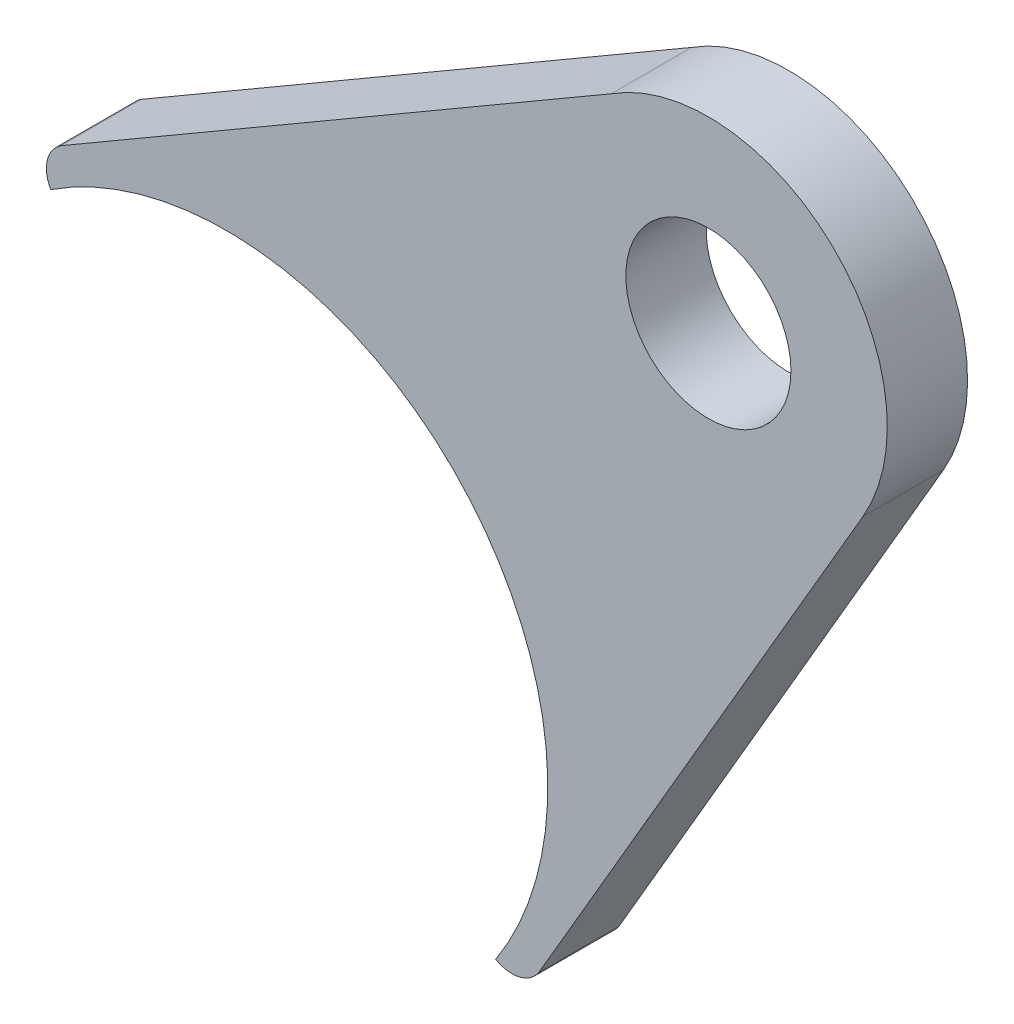
ISO-10303-21;
HEADER;
FILE_DESCRIPTION(('STEP AP214'),'2;1');
FILE_NAME('part.step','',(''),(''),'','','');
FILE_SCHEMA(('AUTOMOTIVE_DESIGN { 1 0 10303 214 1 1 1 1 }'));
ENDSEC;
DATA;
#1=APPLICATION_CONTEXT('core data for automotive mechanical design processes');
#2=APPLICATION_PROTOCOL_DEFINITION('international standard','automotive_design',2000,#1);
#3=PRODUCT_CONTEXT('',#1,'mechanical');
#4=PRODUCT('Part','Part','',(#3));
#5=PRODUCT_RELATED_PRODUCT_CATEGORY('part','',(#4));
#6=PRODUCT_DEFINITION_FORMATION('','',#4);
#7=PRODUCT_DEFINITION_CONTEXT('part definition',#1,'design');
#8=PRODUCT_DEFINITION('design','',#6,#7);
#9=PRODUCT_DEFINITION_SHAPE('','',#8);
#10=(LENGTH_UNIT() NAMED_UNIT(*) SI_UNIT(.MILLI.,.METRE.));
#11=(NAMED_UNIT(*) PLANE_ANGLE_UNIT() SI_UNIT($,.RADIAN.));
#12=(NAMED_UNIT(*) SI_UNIT($,.STERADIAN.) SOLID_ANGLE_UNIT());
#13=UNCERTAINTY_MEASURE_WITH_UNIT(LENGTH_MEASURE(1.E-05),#10,'distance_accuracy_value','');
#14=(GEOMETRIC_REPRESENTATION_CONTEXT(3) GLOBAL_UNCERTAINTY_ASSIGNED_CONTEXT((#13)) GLOBAL_UNIT_ASSIGNED_CONTEXT((#10,
#11,#12)) REPRESENTATION_CONTEXT('',''));
#15=CARTESIAN_POINT('',(0.,0.,0.));
#16=DIRECTION('',(0.,0.,1.));
#17=DIRECTION('',(1.,0.,0.));
#18=AXIS2_PLACEMENT_3D('',#15,#16,#17);
#19=CARTESIAN_POINT('',(-5.85837434433906,11.2675371729913,3.175));
#20=DIRECTION('',(0.,0.,-1.));
#21=DIRECTION('',(-1.,0.,0.));
#22=AXIS2_PLACEMENT_3D('',#19,#20,#21);
#23=PLANE('',#22);
#24=CARTESIAN_POINT('',(-5.85837434433906,11.2675371729913,3.175));
#25=DIRECTION('',(0.,0.,1.));
#26=DIRECTION('',(-1.,0.,0.));
#27=AXIS2_PLACEMENT_3D('',#24,#25,#26);
#28=CIRCLE('',#27,1.26999999999994);
#29=CARTESIAN_POINT('',(-6.54906316048158,12.3332993224671,3.175));
#30=VERTEX_POINT('',#29);
#31=CARTESIAN_POINT('',(-6.9547066047242,10.6264790049294,3.175));
#32=VERTEX_POINT('',#31);
#33=EDGE_CURVE('E159',#30,#32,#28,.T.);
#34=ORIENTED_EDGE('',*,*,#33,.T.);
#35=CARTESIAN_POINT('',(0.,0.,3.175));
#36=DIRECTION('',(0.,0.,-1.));
#37=DIRECTION('',(1.,0.,0.));
#38=AXIS2_PLACEMENT_3D('',#35,#36,#37);
#39=CIRCLE('',#38,12.7);
#40=CARTESIAN_POINT('',(10.6407084109418,-6.93291601804849,3.175));
#41=VERTEX_POINT('',#40);
#42=EDGE_CURVE('E106',#32,#41,#39,.T.);
#43=ORIENTED_EDGE('',*,*,#42,.T.);
#44=CARTESIAN_POINT('',(11.2818459493319,-5.83663017171689,3.175));
#45=DIRECTION('',(0.,0.,1.));
#46=DIRECTION('',(1.,0.,0.));
#47=AXIS2_PLACEMENT_3D('',#44,#45,#46);
#48=CIRCLE('',#47,1.27);
#49=CARTESIAN_POINT('',(12.3488934742751,-6.52533154351209,3.175));
#50=VERTEX_POINT('',#49);
#51=EDGE_CURVE('E119',#41,#50,#48,.T.);
#52=ORIENTED_EDGE('',*,*,#51,.T.);
#53=DIRECTION('',(0.503040153440547,0.864263040993025,0.));
#54=VECTOR('',#53,1.);
#55=CARTESIAN_POINT('',(12.3488934742751,-6.52533154351209,3.175));
#56=LINE('',#55,#54);
#57=CARTESIAN_POINT('',(25.1637103256806,15.4915442585769,3.175));
#58=VERTEX_POINT('',#57);
#59=EDGE_CURVE('E113',#50,#58,#56,.T.);
#60=ORIENTED_EDGE('',*,*,#59,.T.);
#61=CARTESIAN_POINT('',(19.05,19.05,3.175));
#62=DIRECTION('',(0.,0.,1.));
#63=DIRECTION('',(1.,0.,0.));
#64=AXIS2_PLACEMENT_3D('',#61,#62,#63);
#65=CIRCLE('',#64,7.07389999999995);
#66=CARTESIAN_POINT('',(15.2028632940858,24.9862951725809,3.175));
#67=VERTEX_POINT('',#66);
#68=EDGE_CURVE('E117',#58,#67,#65,.T.);
#69=ORIENTED_EDGE('',*,*,#68,.T.);
#70=DIRECTION('',(-0.86439446197605,-0.502814293855232,0.));
#71=VECTOR('',#70,1.);
#72=CARTESIAN_POINT('',(-6.54906316048158,12.3332993224671,3.175));
#73=LINE('',#72,#71);
#74=EDGE_CURVE('E69',#67,#30,#73,.T.);
#75=ORIENTED_EDGE('',*,*,#74,.T.);
#76=EDGE_LOOP('',(#34,#43,#52,#60,#69,#75));
#77=FACE_BOUND('',#76,.T.);
#78=CARTESIAN_POINT('',(19.05,19.05,3.175));
#79=DIRECTION('',(0.,0.,1.));
#80=DIRECTION('',(1.,0.,0.));
#81=AXIS2_PLACEMENT_3D('',#78,#79,#80);
#82=CIRCLE('',#81,3.2639);
#83=CARTESIAN_POINT('',(22.3139,19.05,3.175));
#84=VERTEX_POINT('',#83);
#85=EDGE_CURVE('E147',#84,#84,#82,.T.);
#86=ORIENTED_EDGE('',*,*,#85,.F.);
#87=EDGE_LOOP('',(#86));
#88=FACE_BOUND('',#87,.T.);
#89=ADVANCED_FACE('F51',(#77,#88),#23,.F.);
#90=CARTESIAN_POINT('',(-5.85837434433906,11.2675371729913,0.));
#91=DIRECTION('',(0.,0.,-1.));
#92=DIRECTION('',(-1.,0.,0.));
#93=AXIS2_PLACEMENT_3D('',#90,#91,#92);
#94=PLANE('',#93);
#95=CARTESIAN_POINT('',(-5.85837434433906,11.2675371729913,0.));
#96=DIRECTION('',(0.,0.,1.));
#97=DIRECTION('',(-1.,0.,0.));
#98=AXIS2_PLACEMENT_3D('',#95,#96,#97);
#99=CIRCLE('',#98,1.26999999999994);
#100=CARTESIAN_POINT('',(-6.54906316048158,12.3332993224671,0.));
#101=VERTEX_POINT('',#100);
#102=CARTESIAN_POINT('',(-6.9547066047242,10.6264790049294,0.));
#103=VERTEX_POINT('',#102);
#104=EDGE_CURVE('E142',#101,#103,#99,.T.);
#105=ORIENTED_EDGE('',*,*,#104,.F.);
#106=DIRECTION('',(-0.86439446197605,-0.502814293855232,0.));
#107=VECTOR('',#106,1.);
#108=CARTESIAN_POINT('',(-6.54906316048158,12.3332993224671,0.));
#109=LINE('',#108,#107);
#110=CARTESIAN_POINT('',(15.2028632940858,24.9862951725809,0.));
#111=VERTEX_POINT('',#110);
#112=EDGE_CURVE('E98',#111,#101,#109,.T.);
#113=ORIENTED_EDGE('',*,*,#112,.F.);
#114=CARTESIAN_POINT('',(19.05,19.05,0.));
#115=DIRECTION('',(0.,0.,1.));
#116=DIRECTION('',(1.,0.,0.));
#117=AXIS2_PLACEMENT_3D('',#114,#115,#116);
#118=CIRCLE('',#117,7.07389999999995);
#119=CARTESIAN_POINT('',(25.1637103256806,15.4915442585769,0.));
#120=VERTEX_POINT('',#119);
#121=EDGE_CURVE('E92',#120,#111,#118,.T.);
#122=ORIENTED_EDGE('',*,*,#121,.F.);
#123=DIRECTION('',(0.503040153440547,0.864263040993025,0.));
#124=VECTOR('',#123,1.);
#125=CARTESIAN_POINT('',(12.3488934742751,-6.52533154351209,0.));
#126=LINE('',#125,#124);
#127=CARTESIAN_POINT('',(12.3488934742751,-6.52533154351209,0.));
#128=VERTEX_POINT('',#127);
#129=EDGE_CURVE('E128',#128,#120,#126,.T.);
#130=ORIENTED_EDGE('',*,*,#129,.F.);
#131=CARTESIAN_POINT('',(11.2818459493319,-5.83663017171689,0.));
#132=DIRECTION('',(0.,0.,1.));
#133=DIRECTION('',(1.,0.,0.));
#134=AXIS2_PLACEMENT_3D('',#131,#132,#133);
#135=CIRCLE('',#134,1.27);
#136=CARTESIAN_POINT('',(10.6407084109418,-6.93291601804849,0.));
#137=VERTEX_POINT('',#136);
#138=EDGE_CURVE('E150',#137,#128,#135,.T.);
#139=ORIENTED_EDGE('',*,*,#138,.F.);
#140=CARTESIAN_POINT('',(0.,0.,0.));
#141=DIRECTION('',(0.,0.,-1.));
#142=DIRECTION('',(1.,0.,0.));
#143=AXIS2_PLACEMENT_3D('',#140,#141,#142);
#144=CIRCLE('',#143,12.7);
#145=EDGE_CURVE('E146',#103,#137,#144,.T.);
#146=ORIENTED_EDGE('',*,*,#145,.F.);
#147=EDGE_LOOP('',(#105,#113,#122,#130,#139,#146));
#148=FACE_BOUND('',#147,.T.);
#149=CARTESIAN_POINT('',(19.05,19.05,0.));
#150=DIRECTION('',(0.,0.,1.));
#151=DIRECTION('',(1.,0.,0.));
#152=AXIS2_PLACEMENT_3D('',#149,#150,#151);
#153=CIRCLE('',#152,3.2639);
#154=CARTESIAN_POINT('',(22.3139,19.05,0.));
#155=VERTEX_POINT('',#154);
#156=EDGE_CURVE('E257',#155,#155,#153,.T.);
#157=ORIENTED_EDGE('',*,*,#156,.T.);
#158=EDGE_LOOP('',(#157));
#159=FACE_BOUND('',#158,.T.);
#160=ADVANCED_FACE('F173',(#148,#159),#94,.T.);
#161=CARTESIAN_POINT('',(-5.85837434433906,11.2675371729913,3.175));
#162=DIRECTION('',(0.,0.,-1.));
#163=DIRECTION('',(-1.,0.,0.));
#164=AXIS2_PLACEMENT_3D('',#161,#162,#163);
#165=CYLINDRICAL_SURFACE('',#164,1.26999999999994);
#166=ORIENTED_EDGE('',*,*,#104,.T.);
#167=DIRECTION('',(0.,0.,-1.));
#168=VECTOR('',#167,1.);
#169=CARTESIAN_POINT('',(-6.9547066047242,10.6264790049294,3.175));
#170=LINE('',#169,#168);
#171=EDGE_CURVE('E13',#32,#103,#170,.T.);
#172=ORIENTED_EDGE('',*,*,#171,.F.);
#173=ORIENTED_EDGE('',*,*,#33,.F.);
#174=DIRECTION('',(0.,0.,-1.));
#175=VECTOR('',#174,1.);
#176=CARTESIAN_POINT('',(-6.54906316048158,12.3332993224671,3.175));
#177=LINE('',#176,#175);
#178=EDGE_CURVE('E138',#30,#101,#177,.T.);
#179=ORIENTED_EDGE('',*,*,#178,.T.);
#180=EDGE_LOOP('',(#166,#172,#173,#179));
#181=FACE_BOUND('',#180,.T.);
#182=ADVANCED_FACE('F53',(#181),#165,.T.);
#183=CARTESIAN_POINT('',(0.,0.,3.175));
#184=DIRECTION('',(0.,0.,-1.));
#185=DIRECTION('',(-1.,0.,0.));
#186=AXIS2_PLACEMENT_3D('',#183,#184,#185);
#187=CYLINDRICAL_SURFACE('',#186,12.7);
#188=ORIENTED_EDGE('',*,*,#145,.T.);
#189=DIRECTION('',(0.,0.,-1.));
#190=VECTOR('',#189,1.);
#191=CARTESIAN_POINT('',(10.6407084109418,-6.93291601804849,3.175));
#192=LINE('',#191,#190);
#193=EDGE_CURVE('E61',#41,#137,#192,.T.);
#194=ORIENTED_EDGE('',*,*,#193,.F.);
#195=ORIENTED_EDGE('',*,*,#42,.F.);
#196=ORIENTED_EDGE('',*,*,#171,.T.);
#197=EDGE_LOOP('',(#188,#194,#195,#196));
#198=FACE_BOUND('',#197,.T.);
#199=ADVANCED_FACE('F198',(#198),#187,.F.);
#200=CARTESIAN_POINT('',(11.2818459493319,-5.83663017171689,3.175));
#201=DIRECTION('',(0.,0.,-1.));
#202=DIRECTION('',(-1.,0.,0.));
#203=AXIS2_PLACEMENT_3D('',#200,#201,#202);
#204=CYLINDRICAL_SURFACE('',#203,1.27);
#205=ORIENTED_EDGE('',*,*,#138,.T.);
#206=DIRECTION('',(0.,0.,-1.));
#207=VECTOR('',#206,1.);
#208=CARTESIAN_POINT('',(12.3488934742751,-6.52533154351209,3.175));
#209=LINE('',#208,#207);
#210=EDGE_CURVE('E130',#50,#128,#209,.T.);
#211=ORIENTED_EDGE('',*,*,#210,.F.);
#212=ORIENTED_EDGE('',*,*,#51,.F.);
#213=ORIENTED_EDGE('',*,*,#193,.T.);
#214=EDGE_LOOP('',(#205,#211,#212,#213));
#215=FACE_BOUND('',#214,.T.);
#216=ADVANCED_FACE('F170',(#215),#204,.T.);
#217=CARTESIAN_POINT('',(12.3488934742751,-6.52533154351209,3.175));
#218=DIRECTION('',(-0.864263040993025,0.503040153440547,0.));
#219=DIRECTION('',(-0.503040153440547,-0.864263040993025,0.));
#220=AXIS2_PLACEMENT_3D('',#217,#218,#219);
#221=PLANE('',#220);
#222=ORIENTED_EDGE('',*,*,#129,.T.);
#223=DIRECTION('',(0.,0.,-1.));
#224=VECTOR('',#223,1.);
#225=CARTESIAN_POINT('',(25.1637103256806,15.4915442585769,3.175));
#226=LINE('',#225,#224);
#227=EDGE_CURVE('E125',#58,#120,#226,.T.);
#228=ORIENTED_EDGE('',*,*,#227,.F.);
#229=ORIENTED_EDGE('',*,*,#59,.F.);
#230=ORIENTED_EDGE('',*,*,#210,.T.);
#231=EDGE_LOOP('',(#222,#228,#229,#230));
#232=FACE_BOUND('',#231,.T.);
#233=ADVANCED_FACE('F126',(#232),#221,.F.);
#234=CARTESIAN_POINT('',(19.05,19.05,3.175));
#235=DIRECTION('',(0.,0.,-1.));
#236=DIRECTION('',(-1.,0.,0.));
#237=AXIS2_PLACEMENT_3D('',#234,#235,#236);
#238=CYLINDRICAL_SURFACE('',#237,7.07389999999995);
#239=ORIENTED_EDGE('',*,*,#121,.T.);
#240=DIRECTION('',(0.,0.,-1.));
#241=VECTOR('',#240,1.);
#242=CARTESIAN_POINT('',(15.2028632940858,24.9862951725809,3.175));
#243=LINE('',#242,#241);
#244=EDGE_CURVE('E131',#67,#111,#243,.T.);
#245=ORIENTED_EDGE('',*,*,#244,.F.);
#246=ORIENTED_EDGE('',*,*,#68,.F.);
#247=ORIENTED_EDGE('',*,*,#227,.T.);
#248=EDGE_LOOP('',(#239,#245,#246,#247));
#249=FACE_BOUND('',#248,.T.);
#250=ADVANCED_FACE('F133',(#249),#238,.T.);
#251=CARTESIAN_POINT('',(-6.54906316048158,12.3332993224671,3.175));
#252=DIRECTION('',(0.502814293855232,-0.86439446197605,0.));
#253=DIRECTION('',(0.86439446197605,0.502814293855232,0.));
#254=AXIS2_PLACEMENT_3D('',#251,#252,#253);
#255=PLANE('',#254);
#256=ORIENTED_EDGE('',*,*,#112,.T.);
#257=ORIENTED_EDGE('',*,*,#178,.F.);
#258=ORIENTED_EDGE('',*,*,#74,.F.);
#259=ORIENTED_EDGE('',*,*,#244,.T.);
#260=EDGE_LOOP('',(#256,#257,#258,#259));
#261=FACE_BOUND('',#260,.T.);
#262=ADVANCED_FACE('F178',(#261),#255,.F.);
#263=CARTESIAN_POINT('',(19.05,19.05,3.175));
#264=DIRECTION('',(0.,0.,-1.));
#265=DIRECTION('',(-1.,0.,0.));
#266=AXIS2_PLACEMENT_3D('',#263,#264,#265);
#267=CYLINDRICAL_SURFACE('',#266,3.2639);
#268=ORIENTED_EDGE('',*,*,#85,.T.);
#269=EDGE_LOOP('',(#268));
#270=FACE_BOUND('',#269,.T.);
#271=ORIENTED_EDGE('',*,*,#156,.F.);
#272=EDGE_LOOP('',(#271));
#273=FACE_BOUND('',#272,.T.);
#274=ADVANCED_FACE('F180',(#270,#273),#267,.F.);
#275=CLOSED_SHELL('',(#89,#160,#182,#199,#216,#233,#250,#262,#274));
#276=MANIFOLD_SOLID_BREP('B2',#275);
#277=ADVANCED_BREP_SHAPE_REPRESENTATION('',(#18,#276),#14);
#278=SHAPE_DEFINITION_REPRESENTATION(#9,#277);
ENDSEC;
END-ISO-10303-21;
